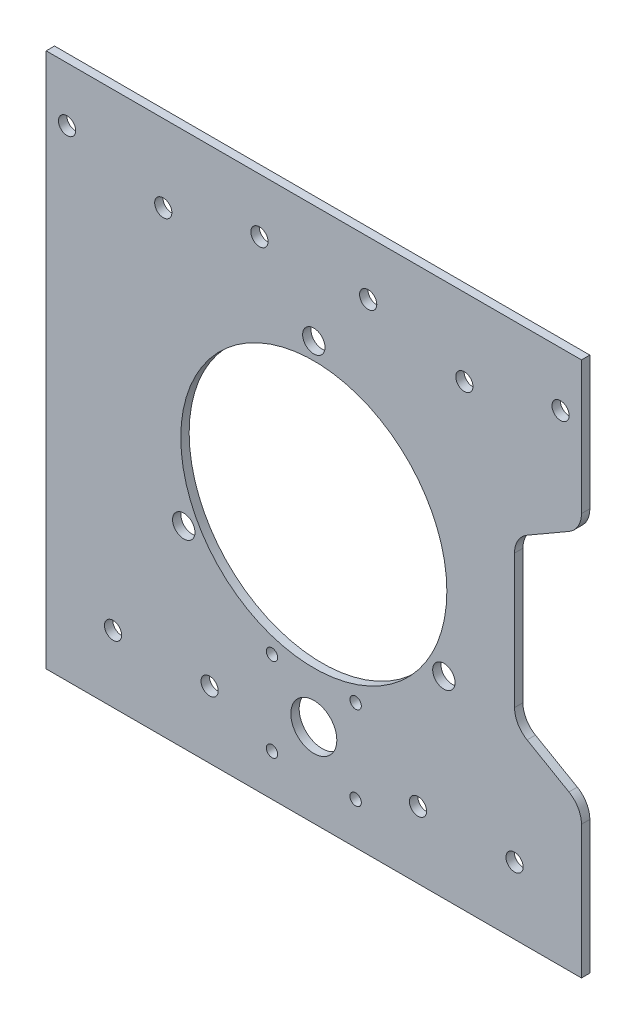
ISO-10303-21;
HEADER;
FILE_DESCRIPTION(('STEP AP214'),'2;1');
FILE_NAME('part.step','',(''),(''),'','','');
FILE_SCHEMA(('AUTOMOTIVE_DESIGN { 1 0 10303 214 1 1 1 1 }'));
ENDSEC;
DATA;
#1=APPLICATION_CONTEXT('core data for automotive mechanical design processes');
#2=APPLICATION_PROTOCOL_DEFINITION('international standard','automotive_design',2000,#1);
#3=PRODUCT_CONTEXT('',#1,'mechanical');
#4=PRODUCT('Part','Part','',(#3));
#5=PRODUCT_RELATED_PRODUCT_CATEGORY('part','',(#4));
#6=PRODUCT_DEFINITION_FORMATION('','',#4);
#7=PRODUCT_DEFINITION_CONTEXT('part definition',#1,'design');
#8=PRODUCT_DEFINITION('design','',#6,#7);
#9=PRODUCT_DEFINITION_SHAPE('','',#8);
#10=(LENGTH_UNIT() NAMED_UNIT(*) SI_UNIT(.MILLI.,.METRE.));
#11=(NAMED_UNIT(*) PLANE_ANGLE_UNIT() SI_UNIT($,.RADIAN.));
#12=(NAMED_UNIT(*) SI_UNIT($,.STERADIAN.) SOLID_ANGLE_UNIT());
#13=UNCERTAINTY_MEASURE_WITH_UNIT(LENGTH_MEASURE(1.E-05),#10,'distance_accuracy_value','');
#14=(GEOMETRIC_REPRESENTATION_CONTEXT(3) GLOBAL_UNCERTAINTY_ASSIGNED_CONTEXT((#13)) GLOBAL_UNIT_ASSIGNED_CONTEXT((#10,
#11,#12)) REPRESENTATION_CONTEXT('',''));
#15=CARTESIAN_POINT('',(0.,0.,0.));
#16=DIRECTION('',(0.,0.,1.));
#17=DIRECTION('',(1.,0.,0.));
#18=AXIS2_PLACEMENT_3D('',#15,#16,#17);
#19=CARTESIAN_POINT('',(101.6,-101.6,-3.175));
#20=DIRECTION('',(1.,0.,0.));
#21=DIRECTION('',(0.,0.,-1.));
#22=AXIS2_PLACEMENT_3D('',#19,#20,#21);
#23=PLANE('',#22);
#24=DIRECTION('',(0.,1.,0.));
#25=VECTOR('',#24,1.);
#26=CARTESIAN_POINT('',(101.6,-101.6,0.));
#27=LINE('',#26,#25);
#28=CARTESIAN_POINT('',(101.6,51.063219465479,0.));
#29=VERTEX_POINT('',#28);
#30=CARTESIAN_POINT('',(101.6,101.6,0.));
#31=VERTEX_POINT('',#30);
#32=EDGE_CURVE('E221',#29,#31,#27,.T.);
#33=ORIENTED_EDGE('',*,*,#32,.F.);
#34=DIRECTION('',(0.,0.,1.));
#35=VECTOR('',#34,1.);
#36=CARTESIAN_POINT('',(101.6,51.063219465479,-3.175));
#37=LINE('',#36,#35);
#38=CARTESIAN_POINT('',(101.6,51.063219465479,-3.175));
#39=VERTEX_POINT('',#38);
#40=EDGE_CURVE('E194',#39,#29,#37,.T.);
#41=ORIENTED_EDGE('',*,*,#40,.F.);
#42=DIRECTION('',(0.,1.,0.));
#43=VECTOR('',#42,1.);
#44=CARTESIAN_POINT('',(101.6,-101.6,-3.175));
#45=LINE('',#44,#43);
#46=CARTESIAN_POINT('',(101.6,101.6,-3.175));
#47=VERTEX_POINT('',#46);
#48=EDGE_CURVE('E83',#39,#47,#45,.T.);
#49=ORIENTED_EDGE('',*,*,#48,.T.);
#50=DIRECTION('',(0.,0.,1.));
#51=VECTOR('',#50,1.);
#52=CARTESIAN_POINT('',(101.6,101.6,-3.175));
#53=LINE('',#52,#51);
#54=EDGE_CURVE('E36',#47,#31,#53,.T.);
#55=ORIENTED_EDGE('',*,*,#54,.T.);
#56=EDGE_LOOP('',(#33,#41,#49,#55));
#57=FACE_BOUND('',#56,.T.);
#58=ADVANCED_FACE('F32',(#57),#23,.T.);
#59=DIRECTION('',(0.,0.,1.));
#60=VECTOR('',#59,1.);
#61=CARTESIAN_POINT('',(101.6,-51.0632194654789,-3.175));
#62=LINE('',#61,#60);
#63=CARTESIAN_POINT('',(101.6,-51.0632194654789,-3.175));
#64=VERTEX_POINT('',#63);
#65=CARTESIAN_POINT('',(101.6,-51.0632194654789,0.));
#66=VERTEX_POINT('',#65);
#67=EDGE_CURVE('E196',#64,#66,#62,.T.);
#68=ORIENTED_EDGE('',*,*,#67,.T.);
#69=CARTESIAN_POINT('',(101.6,-101.6,0.));
#70=VERTEX_POINT('',#69);
#71=EDGE_CURVE('E234',#70,#66,#27,.T.);
#72=ORIENTED_EDGE('',*,*,#71,.F.);
#73=DIRECTION('',(0.,0.,1.));
#74=VECTOR('',#73,1.);
#75=CARTESIAN_POINT('',(101.6,-101.6,-3.175));
#76=LINE('',#75,#74);
#77=CARTESIAN_POINT('',(101.6,-101.6,-3.175));
#78=VERTEX_POINT('',#77);
#79=EDGE_CURVE('E11',#78,#70,#76,.T.);
#80=ORIENTED_EDGE('',*,*,#79,.F.);
#81=EDGE_CURVE('E224',#78,#64,#45,.T.);
#82=ORIENTED_EDGE('',*,*,#81,.T.);
#83=EDGE_LOOP('',(#68,#72,#80,#82));
#84=FACE_BOUND('',#83,.T.);
#85=ADVANCED_FACE('F34',(#84),#23,.T.);
#86=CARTESIAN_POINT('',(-101.6,-101.6,-3.175));
#87=DIRECTION('',(0.,-1.,0.));
#88=DIRECTION('',(0.,0.,-1.));
#89=AXIS2_PLACEMENT_3D('',#86,#87,#88);
#90=PLANE('',#89);
#91=DIRECTION('',(1.,0.,0.));
#92=VECTOR('',#91,1.);
#93=CARTESIAN_POINT('',(-101.6,-101.6,0.));
#94=LINE('',#93,#92);
#95=CARTESIAN_POINT('',(-101.6,-101.6,0.));
#96=VERTEX_POINT('',#95);
#97=EDGE_CURVE('E243',#96,#70,#94,.T.);
#98=ORIENTED_EDGE('',*,*,#97,.F.);
#99=DIRECTION('',(0.,0.,1.));
#100=VECTOR('',#99,1.);
#101=CARTESIAN_POINT('',(-101.6,-101.6,-3.175));
#102=LINE('',#101,#100);
#103=CARTESIAN_POINT('',(-101.6,-101.6,-3.175));
#104=VERTEX_POINT('',#103);
#105=EDGE_CURVE('E41',#104,#96,#102,.T.);
#106=ORIENTED_EDGE('',*,*,#105,.F.);
#107=DIRECTION('',(1.,0.,0.));
#108=VECTOR('',#107,1.);
#109=CARTESIAN_POINT('',(-101.6,-101.6,-3.175));
#110=LINE('',#109,#108);
#111=EDGE_CURVE('E232',#104,#78,#110,.T.);
#112=ORIENTED_EDGE('',*,*,#111,.T.);
#113=ORIENTED_EDGE('',*,*,#79,.T.);
#114=EDGE_LOOP('',(#98,#106,#112,#113));
#115=FACE_BOUND('',#114,.T.);
#116=ADVANCED_FACE('F265',(#115),#90,.T.);
#117=CARTESIAN_POINT('',(-101.6,-101.6,-3.175));
#118=DIRECTION('',(-1.,0.,0.));
#119=DIRECTION('',(0.,0.,1.));
#120=AXIS2_PLACEMENT_3D('',#117,#118,#119);
#121=PLANE('',#120);
#122=DIRECTION('',(0.,-1.,0.));
#123=VECTOR('',#122,1.);
#124=CARTESIAN_POINT('',(-101.6,-101.6,0.));
#125=LINE('',#124,#123);
#126=CARTESIAN_POINT('',(-101.6,101.6,0.));
#127=VERTEX_POINT('',#126);
#128=EDGE_CURVE('E240',#127,#96,#125,.T.);
#129=ORIENTED_EDGE('',*,*,#128,.F.);
#130=DIRECTION('',(0.,0.,1.));
#131=VECTOR('',#130,1.);
#132=CARTESIAN_POINT('',(-101.6,101.6,-3.175));
#133=LINE('',#132,#131);
#134=CARTESIAN_POINT('',(-101.6,101.6,-3.175));
#135=VERTEX_POINT('',#134);
#136=EDGE_CURVE('E246',#135,#127,#133,.T.);
#137=ORIENTED_EDGE('',*,*,#136,.F.);
#138=DIRECTION('',(0.,-1.,0.));
#139=VECTOR('',#138,1.);
#140=CARTESIAN_POINT('',(-101.6,-101.6,-3.175));
#141=LINE('',#140,#139);
#142=EDGE_CURVE('E229',#135,#104,#141,.T.);
#143=ORIENTED_EDGE('',*,*,#142,.T.);
#144=ORIENTED_EDGE('',*,*,#105,.T.);
#145=EDGE_LOOP('',(#129,#137,#143,#144));
#146=FACE_BOUND('',#145,.T.);
#147=ADVANCED_FACE('F264',(#146),#121,.T.);
#148=CARTESIAN_POINT('',(-101.6,101.6,-3.175));
#149=DIRECTION('',(0.,1.,0.));
#150=DIRECTION('',(0.,0.,1.));
#151=AXIS2_PLACEMENT_3D('',#148,#149,#150);
#152=PLANE('',#151);
#153=DIRECTION('',(-1.,0.,0.));
#154=VECTOR('',#153,1.);
#155=CARTESIAN_POINT('',(-101.6,101.6,0.));
#156=LINE('',#155,#154);
#157=EDGE_CURVE('E237',#31,#127,#156,.T.);
#158=ORIENTED_EDGE('',*,*,#157,.F.);
#159=ORIENTED_EDGE('',*,*,#54,.F.);
#160=DIRECTION('',(-1.,0.,0.));
#161=VECTOR('',#160,1.);
#162=CARTESIAN_POINT('',(-101.6,101.6,-3.175));
#163=LINE('',#162,#161);
#164=EDGE_CURVE('E226',#47,#135,#163,.T.);
#165=ORIENTED_EDGE('',*,*,#164,.T.);
#166=ORIENTED_EDGE('',*,*,#136,.T.);
#167=EDGE_LOOP('',(#158,#159,#165,#166));
#168=FACE_BOUND('',#167,.T.);
#169=ADVANCED_FACE('F252',(#168),#152,.T.);
#170=CARTESIAN_POINT('',(0.,0.,-3.175));
#171=DIRECTION('',(0.,0.,-1.));
#172=DIRECTION('',(-1.,0.,0.));
#173=AXIS2_PLACEMENT_3D('',#170,#171,#172);
#174=PLANE('',#173);
#175=CARTESIAN_POINT('',(0.,-69.85,-3.175));
#176=DIRECTION('',(0.,0.,1.));
#177=DIRECTION('',(1.,0.,0.));
#178=AXIS2_PLACEMENT_3D('',#175,#176,#177);
#179=CIRCLE('',#178,8.73125);
#180=CARTESIAN_POINT('',(8.73125,-69.85,-3.175));
#181=VERTEX_POINT('',#180);
#182=EDGE_CURVE('E582',#181,#181,#179,.T.);
#183=ORIENTED_EDGE('',*,*,#182,.T.);
#184=EDGE_LOOP('',(#183));
#185=FACE_BOUND('',#184,.T.);
#186=CARTESIAN_POINT('',(-15.8749903367989,-53.9574937096368,-3.175));
#187=DIRECTION('',(0.,0.,1.));
#188=DIRECTION('',(1.,0.,0.));
#189=AXIS2_PLACEMENT_3D('',#186,#187,#188);
#190=CIRCLE('',#189,2.15265);
#191=CARTESIAN_POINT('',(-13.7223403367989,-53.9574937096368,-3.175));
#192=VERTEX_POINT('',#191);
#193=EDGE_CURVE('E592',#192,#192,#190,.T.);
#194=ORIENTED_EDGE('',*,*,#193,.T.);
#195=EDGE_LOOP('',(#194));
#196=FACE_BOUND('',#195,.T.);
#197=CARTESIAN_POINT('',(15.8749903367989,-53.9574937096368,-3.175));
#198=DIRECTION('',(0.,0.,1.));
#199=DIRECTION('',(1.,0.,0.));
#200=AXIS2_PLACEMENT_3D('',#197,#198,#199);
#201=CIRCLE('',#200,2.15265);
#202=CARTESIAN_POINT('',(18.0276403367989,-53.9574937096368,-3.175));
#203=VERTEX_POINT('',#202);
#204=EDGE_CURVE('E598',#203,#203,#201,.T.);
#205=ORIENTED_EDGE('',*,*,#204,.T.);
#206=EDGE_LOOP('',(#205));
#207=FACE_BOUND('',#206,.T.);
#208=CARTESIAN_POINT('',(-15.8749903367989,-85.7425062903632,-3.175));
#209=DIRECTION('',(0.,0.,1.));
#210=DIRECTION('',(1.,0.,0.));
#211=AXIS2_PLACEMENT_3D('',#208,#209,#210);
#212=CIRCLE('',#211,2.15265);
#213=CARTESIAN_POINT('',(-13.7223403367989,-85.7425062903632,-3.175));
#214=VERTEX_POINT('',#213);
#215=EDGE_CURVE('E604',#214,#214,#212,.T.);
#216=ORIENTED_EDGE('',*,*,#215,.T.);
#217=EDGE_LOOP('',(#216));
#218=FACE_BOUND('',#217,.T.);
#219=CARTESIAN_POINT('',(15.8749903367989,-85.7425062903632,-3.175));
#220=DIRECTION('',(0.,0.,1.));
#221=DIRECTION('',(1.,0.,0.));
#222=AXIS2_PLACEMENT_3D('',#219,#220,#221);
#223=CIRCLE('',#222,2.15265);
#224=CARTESIAN_POINT('',(18.0276403367989,-85.7425062903632,-3.175));
#225=VERTEX_POINT('',#224);
#226=EDGE_CURVE('E610',#225,#225,#223,.T.);
#227=ORIENTED_EDGE('',*,*,#226,.T.);
#228=EDGE_LOOP('',(#227));
#229=FACE_BOUND('',#228,.T.);
#230=CARTESIAN_POINT('',(-93.6625000000001,80.9625,-3.175));
#231=DIRECTION('',(0.,0.,1.));
#232=DIRECTION('',(1.,0.,0.));
#233=AXIS2_PLACEMENT_3D('',#230,#231,#232);
#234=CIRCLE('',#233,3.2639);
#235=CARTESIAN_POINT('',(-90.3986000000001,80.9625,-3.175));
#236=VERTEX_POINT('',#235);
#237=EDGE_CURVE('E616',#236,#236,#234,.T.);
#238=ORIENTED_EDGE('',*,*,#237,.T.);
#239=EDGE_LOOP('',(#238));
#240=FACE_BOUND('',#239,.T.);
#241=CARTESIAN_POINT('',(-57.15,72.23125,-3.175));
#242=DIRECTION('',(0.,0.,1.));
#243=DIRECTION('',(1.,0.,0.));
#244=AXIS2_PLACEMENT_3D('',#241,#242,#243);
#245=CIRCLE('',#244,3.2639);
#246=CARTESIAN_POINT('',(-53.8861,72.23125,-3.175));
#247=VERTEX_POINT('',#246);
#248=EDGE_CURVE('E622',#247,#247,#245,.T.);
#249=ORIENTED_EDGE('',*,*,#248,.T.);
#250=EDGE_LOOP('',(#249));
#251=FACE_BOUND('',#250,.T.);
#252=CARTESIAN_POINT('',(-20.6375,80.9625,-3.175));
#253=DIRECTION('',(0.,0.,1.));
#254=DIRECTION('',(1.,0.,0.));
#255=AXIS2_PLACEMENT_3D('',#252,#253,#254);
#256=CIRCLE('',#255,3.2639);
#257=CARTESIAN_POINT('',(-17.3736,80.9625,-3.175));
#258=VERTEX_POINT('',#257);
#259=EDGE_CURVE('E628',#258,#258,#256,.T.);
#260=ORIENTED_EDGE('',*,*,#259,.T.);
#261=EDGE_LOOP('',(#260));
#262=FACE_BOUND('',#261,.T.);
#263=CARTESIAN_POINT('',(20.6375,80.9625,-3.175));
#264=DIRECTION('',(0.,0.,1.));
#265=DIRECTION('',(1.,0.,0.));
#266=AXIS2_PLACEMENT_3D('',#263,#264,#265);
#267=CIRCLE('',#266,3.2639);
#268=CARTESIAN_POINT('',(23.9014,80.9625,-3.175));
#269=VERTEX_POINT('',#268);
#270=EDGE_CURVE('E634',#269,#269,#267,.T.);
#271=ORIENTED_EDGE('',*,*,#270,.T.);
#272=EDGE_LOOP('',(#271));
#273=FACE_BOUND('',#272,.T.);
#274=CARTESIAN_POINT('',(57.15,72.2312499999999,-3.175));
#275=DIRECTION('',(0.,0.,1.));
#276=DIRECTION('',(1.,0.,0.));
#277=AXIS2_PLACEMENT_3D('',#274,#275,#276);
#278=CIRCLE('',#277,3.2639);
#279=CARTESIAN_POINT('',(60.4139,72.2312499999999,-3.175));
#280=VERTEX_POINT('',#279);
#281=EDGE_CURVE('E640',#280,#280,#278,.T.);
#282=ORIENTED_EDGE('',*,*,#281,.T.);
#283=EDGE_LOOP('',(#282));
#284=FACE_BOUND('',#283,.T.);
#285=CARTESIAN_POINT('',(93.6625,80.9624999999999,-3.175));
#286=DIRECTION('',(0.,0.,1.));
#287=DIRECTION('',(1.,0.,0.));
#288=AXIS2_PLACEMENT_3D('',#285,#286,#287);
#289=CIRCLE('',#288,3.2639);
#290=CARTESIAN_POINT('',(96.9264,80.9624999999999,-3.175));
#291=VERTEX_POINT('',#290);
#292=EDGE_CURVE('E646',#291,#291,#289,.T.);
#293=ORIENTED_EDGE('',*,*,#292,.T.);
#294=EDGE_LOOP('',(#293));
#295=FACE_BOUND('',#294,.T.);
#296=CARTESIAN_POINT('',(76.2,-76.2,-3.175));
#297=DIRECTION('',(0.,0.,1.));
#298=DIRECTION('',(1.,0.,0.));
#299=AXIS2_PLACEMENT_3D('',#296,#297,#298);
#300=CIRCLE('',#299,3.2639);
#301=CARTESIAN_POINT('',(79.4639,-76.2,-3.175));
#302=VERTEX_POINT('',#301);
#303=EDGE_CURVE('E652',#302,#302,#300,.T.);
#304=ORIENTED_EDGE('',*,*,#303,.T.);
#305=EDGE_LOOP('',(#304));
#306=FACE_BOUND('',#305,.T.);
#307=CARTESIAN_POINT('',(39.5531119322837,-76.2,-3.175));
#308=DIRECTION('',(0.,0.,1.));
#309=DIRECTION('',(1.,0.,0.));
#310=AXIS2_PLACEMENT_3D('',#307,#308,#309);
#311=CIRCLE('',#310,3.2639);
#312=CARTESIAN_POINT('',(42.8170119322837,-76.2,-3.175));
#313=VERTEX_POINT('',#312);
#314=EDGE_CURVE('E658',#313,#313,#311,.T.);
#315=ORIENTED_EDGE('',*,*,#314,.T.);
#316=EDGE_LOOP('',(#315));
#317=FACE_BOUND('',#316,.T.);
#318=CARTESIAN_POINT('',(-39.5531119322837,-76.2,-3.175));
#319=DIRECTION('',(0.,0.,1.));
#320=DIRECTION('',(1.,0.,0.));
#321=AXIS2_PLACEMENT_3D('',#318,#319,#320);
#322=CIRCLE('',#321,3.2639);
#323=CARTESIAN_POINT('',(-36.2892119322837,-76.2,-3.175));
#324=VERTEX_POINT('',#323);
#325=EDGE_CURVE('E664',#324,#324,#322,.T.);
#326=ORIENTED_EDGE('',*,*,#325,.T.);
#327=EDGE_LOOP('',(#326));
#328=FACE_BOUND('',#327,.T.);
#329=CARTESIAN_POINT('',(-76.2,-76.2,-3.175));
#330=DIRECTION('',(0.,0.,1.));
#331=DIRECTION('',(1.,0.,0.));
#332=AXIS2_PLACEMENT_3D('',#329,#330,#331);
#333=CIRCLE('',#332,3.2639);
#334=CARTESIAN_POINT('',(-72.9361,-76.2,-3.175));
#335=VERTEX_POINT('',#334);
#336=EDGE_CURVE('E160',#335,#335,#333,.T.);
#337=ORIENTED_EDGE('',*,*,#336,.T.);
#338=EDGE_LOOP('',(#337));
#339=FACE_BOUND('',#338,.T.);
#340=CARTESIAN_POINT('',(92.075,51.063219465479,-3.175));
#341=DIRECTION('',(0.,0.,-1.));
#342=DIRECTION('',(-1.,0.,0.));
#343=AXIS2_PLACEMENT_3D('',#340,#341,#342);
#344=CIRCLE('',#343,9.52500000000001);
#345=CARTESIAN_POINT('',(96.8375,42.8143274944322,-3.175));
#346=VERTEX_POINT('',#345);
#347=EDGE_CURVE('E164',#39,#346,#344,.T.);
#348=ORIENTED_EDGE('',*,*,#347,.T.);
#349=DIRECTION('',(-0.866025403784436,-0.500000000000004,0.));
#350=VECTOR('',#349,1.);
#351=CARTESIAN_POINT('',(96.8375,42.8143274944322,-3.175));
#352=LINE('',#351,#350);
#353=CARTESIAN_POINT('',(80.9625,33.6488919710468,-3.175));
#354=VERTEX_POINT('',#353);
#355=EDGE_CURVE('E166',#346,#354,#352,.T.);
#356=ORIENTED_EDGE('',*,*,#355,.T.);
#357=CARTESIAN_POINT('',(85.725,25.4,-3.175));
#358=DIRECTION('',(0.,0.,1.));
#359=DIRECTION('',(1.,0.,0.));
#360=AXIS2_PLACEMENT_3D('',#357,#358,#359);
#361=CIRCLE('',#360,9.52500000000001);
#362=CARTESIAN_POINT('',(76.2,25.4,-3.175));
#363=VERTEX_POINT('',#362);
#364=EDGE_CURVE('E169',#354,#363,#361,.T.);
#365=ORIENTED_EDGE('',*,*,#364,.T.);
#366=DIRECTION('',(0.,-1.,0.));
#367=VECTOR('',#366,1.);
#368=CARTESIAN_POINT('',(76.2,25.4,-3.175));
#369=LINE('',#368,#367);
#370=CARTESIAN_POINT('',(76.2,-25.4,-3.175));
#371=VERTEX_POINT('',#370);
#372=EDGE_CURVE('E139',#363,#371,#369,.T.);
#373=ORIENTED_EDGE('',*,*,#372,.T.);
#374=CARTESIAN_POINT('',(85.725,-25.4,-3.175));
#375=DIRECTION('',(0.,0.,1.));
#376=DIRECTION('',(1.,0.,0.));
#377=AXIS2_PLACEMENT_3D('',#374,#375,#376);
#378=CIRCLE('',#377,9.52500000000001);
#379=CARTESIAN_POINT('',(80.9625,-33.6488919710468,-3.175));
#380=VERTEX_POINT('',#379);
#381=EDGE_CURVE('E133',#371,#380,#378,.T.);
#382=ORIENTED_EDGE('',*,*,#381,.T.);
#383=DIRECTION('',(0.866025403784437,-0.500000000000004,0.));
#384=VECTOR('',#383,1.);
#385=CARTESIAN_POINT('',(80.9625,-33.6488919710468,-3.175));
#386=LINE('',#385,#384);
#387=CARTESIAN_POINT('',(96.8375,-42.8143274944322,-3.175));
#388=VERTEX_POINT('',#387);
#389=EDGE_CURVE('E142',#380,#388,#386,.T.);
#390=ORIENTED_EDGE('',*,*,#389,.T.);
#391=CARTESIAN_POINT('',(92.075,-51.063219465479,-3.175));
#392=DIRECTION('',(0.,0.,-1.));
#393=DIRECTION('',(-1.,0.,0.));
#394=AXIS2_PLACEMENT_3D('',#391,#392,#393);
#395=CIRCLE('',#394,9.52500000000001);
#396=EDGE_CURVE('E147',#388,#64,#395,.T.);
#397=ORIENTED_EDGE('',*,*,#396,.T.);
#398=ORIENTED_EDGE('',*,*,#81,.F.);
#399=ORIENTED_EDGE('',*,*,#111,.F.);
#400=ORIENTED_EDGE('',*,*,#142,.F.);
#401=ORIENTED_EDGE('',*,*,#164,.F.);
#402=ORIENTED_EDGE('',*,*,#48,.F.);
#403=EDGE_LOOP('',(#348,#356,#365,#373,#382,#390,#397,#398,#399,#400,#401,#402));
#404=FACE_BOUND('',#403,.T.);
#405=CARTESIAN_POINT('',(49.3634480157131,-28.4999999999999,-3.175));
#406=DIRECTION('',(0.,0.,1.));
#407=DIRECTION('',(1.,0.,0.));
#408=AXIS2_PLACEMENT_3D('',#405,#406,#407);
#409=CIRCLE('',#408,4.25);
#410=CARTESIAN_POINT('',(53.6134480157131,-28.4999999999999,-3.175));
#411=VERTEX_POINT('',#410);
#412=EDGE_CURVE('E200',#411,#411,#409,.T.);
#413=ORIENTED_EDGE('',*,*,#412,.T.);
#414=EDGE_LOOP('',(#413));
#415=FACE_BOUND('',#414,.T.);
#416=CARTESIAN_POINT('',(-49.3634480157131,-28.4999999999999,-3.175));
#417=DIRECTION('',(0.,0.,1.));
#418=DIRECTION('',(1.,0.,0.));
#419=AXIS2_PLACEMENT_3D('',#416,#417,#418);
#420=CIRCLE('',#419,4.25);
#421=CARTESIAN_POINT('',(-45.1134480157131,-28.4999999999999,-3.175));
#422=VERTEX_POINT('',#421);
#423=EDGE_CURVE('E206',#422,#422,#420,.T.);
#424=ORIENTED_EDGE('',*,*,#423,.T.);
#425=EDGE_LOOP('',(#424));
#426=FACE_BOUND('',#425,.T.);
#427=CARTESIAN_POINT('',(0.,57.,-3.175));
#428=DIRECTION('',(0.,0.,1.));
#429=DIRECTION('',(1.,0.,0.));
#430=AXIS2_PLACEMENT_3D('',#427,#428,#429);
#431=CIRCLE('',#430,4.25);
#432=CARTESIAN_POINT('',(4.25,57.,-3.175));
#433=VERTEX_POINT('',#432);
#434=EDGE_CURVE('E212',#433,#433,#431,.T.);
#435=ORIENTED_EDGE('',*,*,#434,.T.);
#436=EDGE_LOOP('',(#435));
#437=FACE_BOUND('',#436,.T.);
#438=CARTESIAN_POINT('',(0.,0.,-3.175));
#439=DIRECTION('',(0.,0.,1.));
#440=DIRECTION('',(1.,0.,0.));
#441=AXIS2_PLACEMENT_3D('',#438,#439,#440);
#442=CIRCLE('',#441,50.5);
#443=CARTESIAN_POINT('',(50.5,0.,-3.175));
#444=VERTEX_POINT('',#443);
#445=EDGE_CURVE('E218',#444,#444,#442,.T.);
#446=ORIENTED_EDGE('',*,*,#445,.T.);
#447=EDGE_LOOP('',(#446));
#448=FACE_BOUND('',#447,.T.);
#449=ADVANCED_FACE('F150',(#185,#196,#207,#218,#229,#240,#251,#262,#273,#284,#295,#306,#317,
#328,#339,#404,#415,#426,#437,#448),#174,.T.);
#450=CARTESIAN_POINT('',(0.,0.,0.));
#451=DIRECTION('',(0.,0.,-1.));
#452=DIRECTION('',(-1.,0.,0.));
#453=AXIS2_PLACEMENT_3D('',#450,#451,#452);
#454=PLANE('',#453);
#455=CARTESIAN_POINT('',(0.,-69.85,0.));
#456=DIRECTION('',(0.,0.,1.));
#457=DIRECTION('',(1.,0.,0.));
#458=AXIS2_PLACEMENT_3D('',#455,#456,#457);
#459=CIRCLE('',#458,8.73125);
#460=CARTESIAN_POINT('',(8.73125,-69.85,0.));
#461=VERTEX_POINT('',#460);
#462=EDGE_CURVE('E585',#461,#461,#459,.T.);
#463=ORIENTED_EDGE('',*,*,#462,.F.);
#464=EDGE_LOOP('',(#463));
#465=FACE_BOUND('',#464,.T.);
#466=CARTESIAN_POINT('',(-15.8749903367989,-53.9574937096368,0.));
#467=DIRECTION('',(0.,0.,1.));
#468=DIRECTION('',(1.,0.,0.));
#469=AXIS2_PLACEMENT_3D('',#466,#467,#468);
#470=CIRCLE('',#469,2.15265);
#471=CARTESIAN_POINT('',(-13.7223403367989,-53.9574937096368,0.));
#472=VERTEX_POINT('',#471);
#473=EDGE_CURVE('E587',#472,#472,#470,.T.);
#474=ORIENTED_EDGE('',*,*,#473,.F.);
#475=EDGE_LOOP('',(#474));
#476=FACE_BOUND('',#475,.T.);
#477=CARTESIAN_POINT('',(15.8749903367989,-53.9574937096368,0.));
#478=DIRECTION('',(0.,0.,1.));
#479=DIRECTION('',(1.,0.,0.));
#480=AXIS2_PLACEMENT_3D('',#477,#478,#479);
#481=CIRCLE('',#480,2.15265);
#482=CARTESIAN_POINT('',(18.0276403367989,-53.9574937096368,0.));
#483=VERTEX_POINT('',#482);
#484=EDGE_CURVE('E595',#483,#483,#481,.T.);
#485=ORIENTED_EDGE('',*,*,#484,.F.);
#486=EDGE_LOOP('',(#485));
#487=FACE_BOUND('',#486,.T.);
#488=CARTESIAN_POINT('',(-15.8749903367989,-85.7425062903632,0.));
#489=DIRECTION('',(0.,0.,1.));
#490=DIRECTION('',(1.,0.,0.));
#491=AXIS2_PLACEMENT_3D('',#488,#489,#490);
#492=CIRCLE('',#491,2.15265);
#493=CARTESIAN_POINT('',(-13.7223403367989,-85.7425062903632,0.));
#494=VERTEX_POINT('',#493);
#495=EDGE_CURVE('E601',#494,#494,#492,.T.);
#496=ORIENTED_EDGE('',*,*,#495,.F.);
#497=EDGE_LOOP('',(#496));
#498=FACE_BOUND('',#497,.T.);
#499=CARTESIAN_POINT('',(15.8749903367989,-85.7425062903632,0.));
#500=DIRECTION('',(0.,0.,1.));
#501=DIRECTION('',(1.,0.,0.));
#502=AXIS2_PLACEMENT_3D('',#499,#500,#501);
#503=CIRCLE('',#502,2.15265);
#504=CARTESIAN_POINT('',(18.0276403367989,-85.7425062903632,0.));
#505=VERTEX_POINT('',#504);
#506=EDGE_CURVE('E607',#505,#505,#503,.T.);
#507=ORIENTED_EDGE('',*,*,#506,.F.);
#508=EDGE_LOOP('',(#507));
#509=FACE_BOUND('',#508,.T.);
#510=CARTESIAN_POINT('',(-93.6625000000001,80.9625,0.));
#511=DIRECTION('',(0.,0.,1.));
#512=DIRECTION('',(1.,0.,0.));
#513=AXIS2_PLACEMENT_3D('',#510,#511,#512);
#514=CIRCLE('',#513,3.2639);
#515=CARTESIAN_POINT('',(-90.3986000000001,80.9625,0.));
#516=VERTEX_POINT('',#515);
#517=EDGE_CURVE('E613',#516,#516,#514,.T.);
#518=ORIENTED_EDGE('',*,*,#517,.F.);
#519=EDGE_LOOP('',(#518));
#520=FACE_BOUND('',#519,.T.);
#521=CARTESIAN_POINT('',(-57.15,72.23125,0.));
#522=DIRECTION('',(0.,0.,1.));
#523=DIRECTION('',(1.,0.,0.));
#524=AXIS2_PLACEMENT_3D('',#521,#522,#523);
#525=CIRCLE('',#524,3.2639);
#526=CARTESIAN_POINT('',(-53.8861,72.23125,0.));
#527=VERTEX_POINT('',#526);
#528=EDGE_CURVE('E619',#527,#527,#525,.T.);
#529=ORIENTED_EDGE('',*,*,#528,.F.);
#530=EDGE_LOOP('',(#529));
#531=FACE_BOUND('',#530,.T.);
#532=CARTESIAN_POINT('',(-20.6375,80.9625,0.));
#533=DIRECTION('',(0.,0.,1.));
#534=DIRECTION('',(1.,0.,0.));
#535=AXIS2_PLACEMENT_3D('',#532,#533,#534);
#536=CIRCLE('',#535,3.2639);
#537=CARTESIAN_POINT('',(-17.3736,80.9625,0.));
#538=VERTEX_POINT('',#537);
#539=EDGE_CURVE('E625',#538,#538,#536,.T.);
#540=ORIENTED_EDGE('',*,*,#539,.F.);
#541=EDGE_LOOP('',(#540));
#542=FACE_BOUND('',#541,.T.);
#543=CARTESIAN_POINT('',(20.6375,80.9625,0.));
#544=DIRECTION('',(0.,0.,1.));
#545=DIRECTION('',(1.,0.,0.));
#546=AXIS2_PLACEMENT_3D('',#543,#544,#545);
#547=CIRCLE('',#546,3.2639);
#548=CARTESIAN_POINT('',(23.9014,80.9625,0.));
#549=VERTEX_POINT('',#548);
#550=EDGE_CURVE('E631',#549,#549,#547,.T.);
#551=ORIENTED_EDGE('',*,*,#550,.F.);
#552=EDGE_LOOP('',(#551));
#553=FACE_BOUND('',#552,.T.);
#554=CARTESIAN_POINT('',(57.15,72.2312499999999,0.));
#555=DIRECTION('',(0.,0.,1.));
#556=DIRECTION('',(1.,0.,0.));
#557=AXIS2_PLACEMENT_3D('',#554,#555,#556);
#558=CIRCLE('',#557,3.2639);
#559=CARTESIAN_POINT('',(60.4139,72.2312499999999,0.));
#560=VERTEX_POINT('',#559);
#561=EDGE_CURVE('E637',#560,#560,#558,.T.);
#562=ORIENTED_EDGE('',*,*,#561,.F.);
#563=EDGE_LOOP('',(#562));
#564=FACE_BOUND('',#563,.T.);
#565=CARTESIAN_POINT('',(93.6625,80.9624999999999,0.));
#566=DIRECTION('',(0.,0.,1.));
#567=DIRECTION('',(1.,0.,0.));
#568=AXIS2_PLACEMENT_3D('',#565,#566,#567);
#569=CIRCLE('',#568,3.2639);
#570=CARTESIAN_POINT('',(96.9264,80.9624999999999,0.));
#571=VERTEX_POINT('',#570);
#572=EDGE_CURVE('E643',#571,#571,#569,.T.);
#573=ORIENTED_EDGE('',*,*,#572,.F.);
#574=EDGE_LOOP('',(#573));
#575=FACE_BOUND('',#574,.T.);
#576=CARTESIAN_POINT('',(76.2,-76.2,0.));
#577=DIRECTION('',(0.,0.,1.));
#578=DIRECTION('',(1.,0.,0.));
#579=AXIS2_PLACEMENT_3D('',#576,#577,#578);
#580=CIRCLE('',#579,3.2639);
#581=CARTESIAN_POINT('',(79.4639,-76.2,0.));
#582=VERTEX_POINT('',#581);
#583=EDGE_CURVE('E649',#582,#582,#580,.T.);
#584=ORIENTED_EDGE('',*,*,#583,.F.);
#585=EDGE_LOOP('',(#584));
#586=FACE_BOUND('',#585,.T.);
#587=CARTESIAN_POINT('',(39.5531119322837,-76.2,0.));
#588=DIRECTION('',(0.,0.,1.));
#589=DIRECTION('',(1.,0.,0.));
#590=AXIS2_PLACEMENT_3D('',#587,#588,#589);
#591=CIRCLE('',#590,3.2639);
#592=CARTESIAN_POINT('',(42.8170119322837,-76.2,0.));
#593=VERTEX_POINT('',#592);
#594=EDGE_CURVE('E655',#593,#593,#591,.T.);
#595=ORIENTED_EDGE('',*,*,#594,.F.);
#596=EDGE_LOOP('',(#595));
#597=FACE_BOUND('',#596,.T.);
#598=CARTESIAN_POINT('',(-39.5531119322837,-76.2,0.));
#599=DIRECTION('',(0.,0.,1.));
#600=DIRECTION('',(1.,0.,0.));
#601=AXIS2_PLACEMENT_3D('',#598,#599,#600);
#602=CIRCLE('',#601,3.2639);
#603=CARTESIAN_POINT('',(-36.2892119322837,-76.2,0.));
#604=VERTEX_POINT('',#603);
#605=EDGE_CURVE('E661',#604,#604,#602,.T.);
#606=ORIENTED_EDGE('',*,*,#605,.F.);
#607=EDGE_LOOP('',(#606));
#608=FACE_BOUND('',#607,.T.);
#609=CARTESIAN_POINT('',(-76.2,-76.2,0.));
#610=DIRECTION('',(0.,0.,1.));
#611=DIRECTION('',(1.,0.,0.));
#612=AXIS2_PLACEMENT_3D('',#609,#610,#611);
#613=CIRCLE('',#612,3.2639);
#614=CARTESIAN_POINT('',(-72.9361,-76.2,0.));
#615=VERTEX_POINT('',#614);
#616=EDGE_CURVE('E666',#615,#615,#613,.T.);
#617=ORIENTED_EDGE('',*,*,#616,.F.);
#618=EDGE_LOOP('',(#617));
#619=FACE_BOUND('',#618,.T.);
#620=CARTESIAN_POINT('',(49.3634480157131,-28.4999999999999,0.));
#621=DIRECTION('',(0.,0.,1.));
#622=DIRECTION('',(1.,0.,0.));
#623=AXIS2_PLACEMENT_3D('',#620,#621,#622);
#624=CIRCLE('',#623,4.25);
#625=CARTESIAN_POINT('',(53.6134480157131,-28.4999999999999,0.));
#626=VERTEX_POINT('',#625);
#627=EDGE_CURVE('E187',#626,#626,#624,.T.);
#628=ORIENTED_EDGE('',*,*,#627,.F.);
#629=EDGE_LOOP('',(#628));
#630=FACE_BOUND('',#629,.T.);
#631=CARTESIAN_POINT('',(-49.3634480157131,-28.4999999999999,0.));
#632=DIRECTION('',(0.,0.,1.));
#633=DIRECTION('',(1.,0.,0.));
#634=AXIS2_PLACEMENT_3D('',#631,#632,#633);
#635=CIRCLE('',#634,4.25);
#636=CARTESIAN_POINT('',(-45.1134480157131,-28.4999999999999,0.));
#637=VERTEX_POINT('',#636);
#638=EDGE_CURVE('E203',#637,#637,#635,.T.);
#639=ORIENTED_EDGE('',*,*,#638,.F.);
#640=EDGE_LOOP('',(#639));
#641=FACE_BOUND('',#640,.T.);
#642=CARTESIAN_POINT('',(0.,57.,0.));
#643=DIRECTION('',(0.,0.,1.));
#644=DIRECTION('',(1.,0.,0.));
#645=AXIS2_PLACEMENT_3D('',#642,#643,#644);
#646=CIRCLE('',#645,4.25);
#647=CARTESIAN_POINT('',(4.25,57.,0.));
#648=VERTEX_POINT('',#647);
#649=EDGE_CURVE('E209',#648,#648,#646,.T.);
#650=ORIENTED_EDGE('',*,*,#649,.F.);
#651=EDGE_LOOP('',(#650));
#652=FACE_BOUND('',#651,.T.);
#653=CARTESIAN_POINT('',(0.,0.,0.));
#654=DIRECTION('',(0.,0.,1.));
#655=DIRECTION('',(1.,0.,0.));
#656=AXIS2_PLACEMENT_3D('',#653,#654,#655);
#657=CIRCLE('',#656,50.5);
#658=CARTESIAN_POINT('',(50.5,0.,0.));
#659=VERTEX_POINT('',#658);
#660=EDGE_CURVE('E215',#659,#659,#657,.T.);
#661=ORIENTED_EDGE('',*,*,#660,.F.);
#662=EDGE_LOOP('',(#661));
#663=FACE_BOUND('',#662,.T.);
#664=DIRECTION('',(-0.866025403784436,-0.500000000000004,0.));
#665=VECTOR('',#664,1.);
#666=CARTESIAN_POINT('',(96.8375,42.8143274944322,0.));
#667=LINE('',#666,#665);
#668=CARTESIAN_POINT('',(96.8375,42.8143274944322,0.));
#669=VERTEX_POINT('',#668);
#670=CARTESIAN_POINT('',(80.9625,33.6488919710468,0.));
#671=VERTEX_POINT('',#670);
#672=EDGE_CURVE('E180',#669,#671,#667,.T.);
#673=ORIENTED_EDGE('',*,*,#672,.F.);
#674=CARTESIAN_POINT('',(92.075,51.063219465479,0.));
#675=DIRECTION('',(0.,0.,-1.));
#676=DIRECTION('',(-1.,0.,0.));
#677=AXIS2_PLACEMENT_3D('',#674,#675,#676);
#678=CIRCLE('',#677,9.52500000000001);
#679=EDGE_CURVE('E177',#29,#669,#678,.T.);
#680=ORIENTED_EDGE('',*,*,#679,.F.);
#681=ORIENTED_EDGE('',*,*,#32,.T.);
#682=ORIENTED_EDGE('',*,*,#157,.T.);
#683=ORIENTED_EDGE('',*,*,#128,.T.);
#684=ORIENTED_EDGE('',*,*,#97,.T.);
#685=ORIENTED_EDGE('',*,*,#71,.T.);
#686=CARTESIAN_POINT('',(92.075,-51.063219465479,0.));
#687=DIRECTION('',(0.,0.,-1.));
#688=DIRECTION('',(-1.,0.,0.));
#689=AXIS2_PLACEMENT_3D('',#686,#687,#688);
#690=CIRCLE('',#689,9.52500000000001);
#691=CARTESIAN_POINT('',(96.8375,-42.8143274944322,0.));
#692=VERTEX_POINT('',#691);
#693=EDGE_CURVE('E175',#692,#66,#690,.T.);
#694=ORIENTED_EDGE('',*,*,#693,.F.);
#695=DIRECTION('',(0.866025403784437,-0.500000000000004,0.));
#696=VECTOR('',#695,1.);
#697=CARTESIAN_POINT('',(80.9625,-33.6488919710468,0.));
#698=LINE('',#697,#696);
#699=CARTESIAN_POINT('',(80.9625,-33.6488919710468,0.));
#700=VERTEX_POINT('',#699);
#701=EDGE_CURVE('E173',#700,#692,#698,.T.);
#702=ORIENTED_EDGE('',*,*,#701,.F.);
#703=CARTESIAN_POINT('',(85.725,-25.4,0.));
#704=DIRECTION('',(0.,0.,1.));
#705=DIRECTION('',(1.,0.,0.));
#706=AXIS2_PLACEMENT_3D('',#703,#704,#705);
#707=CIRCLE('',#706,9.52500000000001);
#708=CARTESIAN_POINT('',(76.2,-25.4,0.));
#709=VERTEX_POINT('',#708);
#710=EDGE_CURVE('E49',#709,#700,#707,.T.);
#711=ORIENTED_EDGE('',*,*,#710,.F.);
#712=DIRECTION('',(0.,-1.,0.));
#713=VECTOR('',#712,1.);
#714=CARTESIAN_POINT('',(76.2,25.4,0.));
#715=LINE('',#714,#713);
#716=CARTESIAN_POINT('',(76.2,25.4,0.));
#717=VERTEX_POINT('',#716);
#718=EDGE_CURVE('E154',#717,#709,#715,.T.);
#719=ORIENTED_EDGE('',*,*,#718,.F.);
#720=CARTESIAN_POINT('',(85.725,25.4,0.));
#721=DIRECTION('',(0.,0.,1.));
#722=DIRECTION('',(1.,0.,0.));
#723=AXIS2_PLACEMENT_3D('',#720,#721,#722);
#724=CIRCLE('',#723,9.52500000000001);
#725=EDGE_CURVE('E157',#671,#717,#724,.T.);
#726=ORIENTED_EDGE('',*,*,#725,.F.);
#727=EDGE_LOOP('',(#673,#680,#681,#682,#683,#684,#685,#694,#702,#711,#719,#726));
#728=FACE_BOUND('',#727,.T.);
#729=ADVANCED_FACE('F255',(#465,#476,#487,#498,#509,#520,#531,#542,#553,#564,#575,#586,#597,
#608,#619,#630,#641,#652,#663,#728),#454,.F.);
#730=CARTESIAN_POINT('',(0.,0.,-3.175));
#731=DIRECTION('',(0.,0.,1.));
#732=DIRECTION('',(1.,0.,0.));
#733=AXIS2_PLACEMENT_3D('',#730,#731,#732);
#734=CYLINDRICAL_SURFACE('',#733,50.5);
#735=ORIENTED_EDGE('',*,*,#445,.F.);
#736=EDGE_LOOP('',(#735));
#737=FACE_BOUND('',#736,.T.);
#738=ORIENTED_EDGE('',*,*,#660,.T.);
#739=EDGE_LOOP('',(#738));
#740=FACE_BOUND('',#739,.T.);
#741=ADVANCED_FACE('F307',(#737,#740),#734,.F.);
#742=CARTESIAN_POINT('',(0.,57.,-3.175));
#743=DIRECTION('',(0.,0.,1.));
#744=DIRECTION('',(1.,0.,0.));
#745=AXIS2_PLACEMENT_3D('',#742,#743,#744);
#746=CYLINDRICAL_SURFACE('',#745,4.25);
#747=ORIENTED_EDGE('',*,*,#434,.F.);
#748=EDGE_LOOP('',(#747));
#749=FACE_BOUND('',#748,.T.);
#750=ORIENTED_EDGE('',*,*,#649,.T.);
#751=EDGE_LOOP('',(#750));
#752=FACE_BOUND('',#751,.T.);
#753=ADVANCED_FACE('F314',(#749,#752),#746,.F.);
#754=CARTESIAN_POINT('',(-49.3634480157131,-28.4999999999999,-3.175));
#755=DIRECTION('',(0.,0.,1.));
#756=DIRECTION('',(1.,0.,0.));
#757=AXIS2_PLACEMENT_3D('',#754,#755,#756);
#758=CYLINDRICAL_SURFACE('',#757,4.25);
#759=ORIENTED_EDGE('',*,*,#423,.F.);
#760=EDGE_LOOP('',(#759));
#761=FACE_BOUND('',#760,.T.);
#762=ORIENTED_EDGE('',*,*,#638,.T.);
#763=EDGE_LOOP('',(#762));
#764=FACE_BOUND('',#763,.T.);
#765=ADVANCED_FACE('F318',(#761,#764),#758,.F.);
#766=CARTESIAN_POINT('',(49.3634480157131,-28.4999999999999,-3.175));
#767=DIRECTION('',(0.,0.,1.));
#768=DIRECTION('',(1.,0.,0.));
#769=AXIS2_PLACEMENT_3D('',#766,#767,#768);
#770=CYLINDRICAL_SURFACE('',#769,4.25);
#771=ORIENTED_EDGE('',*,*,#412,.F.);
#772=EDGE_LOOP('',(#771));
#773=FACE_BOUND('',#772,.T.);
#774=ORIENTED_EDGE('',*,*,#627,.T.);
#775=EDGE_LOOP('',(#774));
#776=FACE_BOUND('',#775,.T.);
#777=ADVANCED_FACE('F322',(#773,#776),#770,.F.);
#778=CARTESIAN_POINT('',(85.725,-25.4,-3.175));
#779=DIRECTION('',(0.,0.,1.));
#780=DIRECTION('',(1.,0.,0.));
#781=AXIS2_PLACEMENT_3D('',#778,#779,#780);
#782=CYLINDRICAL_SURFACE('',#781,9.52500000000001);
#783=ORIENTED_EDGE('',*,*,#710,.T.);
#784=DIRECTION('',(0.,0.,1.));
#785=VECTOR('',#784,1.);
#786=CARTESIAN_POINT('',(80.9625,-33.6488919710468,-3.175));
#787=LINE('',#786,#785);
#788=EDGE_CURVE('E129',#380,#700,#787,.T.);
#789=ORIENTED_EDGE('',*,*,#788,.F.);
#790=ORIENTED_EDGE('',*,*,#381,.F.);
#791=DIRECTION('',(0.,0.,1.));
#792=VECTOR('',#791,1.);
#793=CARTESIAN_POINT('',(76.2,-25.4,-3.175));
#794=LINE('',#793,#792);
#795=EDGE_CURVE('E185',#371,#709,#794,.T.);
#796=ORIENTED_EDGE('',*,*,#795,.T.);
#797=EDGE_LOOP('',(#783,#789,#790,#796));
#798=FACE_BOUND('',#797,.T.);
#799=ADVANCED_FACE('F131',(#798),#782,.F.);
#800=CARTESIAN_POINT('',(76.2,25.4,-3.175));
#801=DIRECTION('',(-1.,0.,0.));
#802=DIRECTION('',(0.,0.,1.));
#803=AXIS2_PLACEMENT_3D('',#800,#801,#802);
#804=PLANE('',#803);
#805=ORIENTED_EDGE('',*,*,#718,.T.);
#806=ORIENTED_EDGE('',*,*,#795,.F.);
#807=ORIENTED_EDGE('',*,*,#372,.F.);
#808=DIRECTION('',(0.,0.,1.));
#809=VECTOR('',#808,1.);
#810=CARTESIAN_POINT('',(76.2,25.4,-3.175));
#811=LINE('',#810,#809);
#812=EDGE_CURVE('E188',#363,#717,#811,.T.);
#813=ORIENTED_EDGE('',*,*,#812,.T.);
#814=EDGE_LOOP('',(#805,#806,#807,#813));
#815=FACE_BOUND('',#814,.T.);
#816=ADVANCED_FACE('F271',(#815),#804,.F.);
#817=CARTESIAN_POINT('',(85.725,25.4,-3.175));
#818=DIRECTION('',(0.,0.,1.));
#819=DIRECTION('',(1.,0.,0.));
#820=AXIS2_PLACEMENT_3D('',#817,#818,#819);
#821=CYLINDRICAL_SURFACE('',#820,9.52500000000001);
#822=ORIENTED_EDGE('',*,*,#725,.T.);
#823=ORIENTED_EDGE('',*,*,#812,.F.);
#824=ORIENTED_EDGE('',*,*,#364,.F.);
#825=DIRECTION('',(0.,0.,1.));
#826=VECTOR('',#825,1.);
#827=CARTESIAN_POINT('',(80.9625,33.6488919710468,-3.175));
#828=LINE('',#827,#826);
#829=EDGE_CURVE('E190',#354,#671,#828,.T.);
#830=ORIENTED_EDGE('',*,*,#829,.T.);
#831=EDGE_LOOP('',(#822,#823,#824,#830));
#832=FACE_BOUND('',#831,.T.);
#833=ADVANCED_FACE('F274',(#832),#821,.F.);
#834=CARTESIAN_POINT('',(96.8375,42.8143274944322,-3.175));
#835=DIRECTION('',(-0.500000000000004,0.866025403784436,0.));
#836=DIRECTION('',(-0.866025403784436,-0.500000000000004,0.));
#837=AXIS2_PLACEMENT_3D('',#834,#835,#836);
#838=PLANE('',#837);
#839=ORIENTED_EDGE('',*,*,#672,.T.);
#840=ORIENTED_EDGE('',*,*,#829,.F.);
#841=ORIENTED_EDGE('',*,*,#355,.F.);
#842=DIRECTION('',(0.,0.,1.));
#843=VECTOR('',#842,1.);
#844=CARTESIAN_POINT('',(96.8375,42.8143274944322,-3.175));
#845=LINE('',#844,#843);
#846=EDGE_CURVE('E192',#346,#669,#845,.T.);
#847=ORIENTED_EDGE('',*,*,#846,.T.);
#848=EDGE_LOOP('',(#839,#840,#841,#847));
#849=FACE_BOUND('',#848,.T.);
#850=ADVANCED_FACE('F276',(#849),#838,.F.);
#851=CARTESIAN_POINT('',(92.075,51.063219465479,-3.175));
#852=DIRECTION('',(0.,0.,1.));
#853=DIRECTION('',(1.,0.,0.));
#854=AXIS2_PLACEMENT_3D('',#851,#852,#853);
#855=CYLINDRICAL_SURFACE('',#854,9.52500000000001);
#856=ORIENTED_EDGE('',*,*,#679,.T.);
#857=ORIENTED_EDGE('',*,*,#846,.F.);
#858=ORIENTED_EDGE('',*,*,#347,.F.);
#859=ORIENTED_EDGE('',*,*,#40,.T.);
#860=EDGE_LOOP('',(#856,#857,#858,#859));
#861=FACE_BOUND('',#860,.T.);
#862=ADVANCED_FACE('F259',(#861),#855,.T.);
#863=CARTESIAN_POINT('',(92.075,-51.063219465479,-3.175));
#864=DIRECTION('',(0.,0.,1.));
#865=DIRECTION('',(1.,0.,0.));
#866=AXIS2_PLACEMENT_3D('',#863,#864,#865);
#867=CYLINDRICAL_SURFACE('',#866,9.52500000000001);
#868=ORIENTED_EDGE('',*,*,#693,.T.);
#869=ORIENTED_EDGE('',*,*,#67,.F.);
#870=ORIENTED_EDGE('',*,*,#396,.F.);
#871=DIRECTION('',(0.,0.,1.));
#872=VECTOR('',#871,1.);
#873=CARTESIAN_POINT('',(96.8375,-42.8143274944322,-3.175));
#874=LINE('',#873,#872);
#875=EDGE_CURVE('E138',#388,#692,#874,.T.);
#876=ORIENTED_EDGE('',*,*,#875,.T.);
#877=EDGE_LOOP('',(#868,#869,#870,#876));
#878=FACE_BOUND('',#877,.T.);
#879=ADVANCED_FACE('F268',(#878),#867,.T.);
#880=CARTESIAN_POINT('',(80.9625,-33.6488919710468,-3.175));
#881=DIRECTION('',(-0.500000000000004,-0.866025403784436,0.));
#882=DIRECTION('',(0.866025403784437,-0.500000000000004,0.));
#883=AXIS2_PLACEMENT_3D('',#880,#881,#882);
#884=PLANE('',#883);
#885=ORIENTED_EDGE('',*,*,#701,.T.);
#886=ORIENTED_EDGE('',*,*,#875,.F.);
#887=ORIENTED_EDGE('',*,*,#389,.F.);
#888=ORIENTED_EDGE('',*,*,#788,.T.);
#889=EDGE_LOOP('',(#885,#886,#887,#888));
#890=FACE_BOUND('',#889,.T.);
#891=ADVANCED_FACE('F143',(#890),#884,.F.);
#892=CARTESIAN_POINT('',(-76.2,-76.2,0.));
#893=DIRECTION('',(0.,0.,1.));
#894=DIRECTION('',(1.,0.,0.));
#895=AXIS2_PLACEMENT_3D('',#892,#893,#894);
#896=CYLINDRICAL_SURFACE('',#895,3.2639);
#897=ORIENTED_EDGE('',*,*,#336,.F.);
#898=EDGE_LOOP('',(#897));
#899=FACE_BOUND('',#898,.T.);
#900=ORIENTED_EDGE('',*,*,#616,.T.);
#901=EDGE_LOOP('',(#900));
#902=FACE_BOUND('',#901,.T.);
#903=ADVANCED_FACE('F331',(#899,#902),#896,.F.);
#904=CARTESIAN_POINT('',(-39.5531119322837,-76.2,0.));
#905=DIRECTION('',(0.,0.,1.));
#906=DIRECTION('',(1.,0.,0.));
#907=AXIS2_PLACEMENT_3D('',#904,#905,#906);
#908=CYLINDRICAL_SURFACE('',#907,3.2639);
#909=ORIENTED_EDGE('',*,*,#325,.F.);
#910=EDGE_LOOP('',(#909));
#911=FACE_BOUND('',#910,.T.);
#912=ORIENTED_EDGE('',*,*,#605,.T.);
#913=EDGE_LOOP('',(#912));
#914=FACE_BOUND('',#913,.T.);
#915=ADVANCED_FACE('F347',(#911,#914),#908,.F.);
#916=CARTESIAN_POINT('',(39.5531119322837,-76.2,0.));
#917=DIRECTION('',(0.,0.,1.));
#918=DIRECTION('',(1.,0.,0.));
#919=AXIS2_PLACEMENT_3D('',#916,#917,#918);
#920=CYLINDRICAL_SURFACE('',#919,3.2639);
#921=ORIENTED_EDGE('',*,*,#314,.F.);
#922=EDGE_LOOP('',(#921));
#923=FACE_BOUND('',#922,.T.);
#924=ORIENTED_EDGE('',*,*,#594,.T.);
#925=EDGE_LOOP('',(#924));
#926=FACE_BOUND('',#925,.T.);
#927=ADVANCED_FACE('F355',(#923,#926),#920,.F.);
#928=CARTESIAN_POINT('',(76.2,-76.2,0.));
#929=DIRECTION('',(0.,0.,1.));
#930=DIRECTION('',(1.,0.,0.));
#931=AXIS2_PLACEMENT_3D('',#928,#929,#930);
#932=CYLINDRICAL_SURFACE('',#931,3.2639);
#933=ORIENTED_EDGE('',*,*,#303,.F.);
#934=EDGE_LOOP('',(#933));
#935=FACE_BOUND('',#934,.T.);
#936=ORIENTED_EDGE('',*,*,#583,.T.);
#937=EDGE_LOOP('',(#936));
#938=FACE_BOUND('',#937,.T.);
#939=ADVANCED_FACE('F363',(#935,#938),#932,.F.);
#940=CARTESIAN_POINT('',(93.6625,80.9624999999999,0.));
#941=DIRECTION('',(0.,0.,1.));
#942=DIRECTION('',(1.,0.,0.));
#943=AXIS2_PLACEMENT_3D('',#940,#941,#942);
#944=CYLINDRICAL_SURFACE('',#943,3.2639);
#945=ORIENTED_EDGE('',*,*,#292,.F.);
#946=EDGE_LOOP('',(#945));
#947=FACE_BOUND('',#946,.T.);
#948=ORIENTED_EDGE('',*,*,#572,.T.);
#949=EDGE_LOOP('',(#948));
#950=FACE_BOUND('',#949,.T.);
#951=ADVANCED_FACE('F371',(#947,#950),#944,.F.);
#952=CARTESIAN_POINT('',(57.15,72.2312499999999,0.));
#953=DIRECTION('',(0.,0.,1.));
#954=DIRECTION('',(1.,0.,0.));
#955=AXIS2_PLACEMENT_3D('',#952,#953,#954);
#956=CYLINDRICAL_SURFACE('',#955,3.2639);
#957=ORIENTED_EDGE('',*,*,#281,.F.);
#958=EDGE_LOOP('',(#957));
#959=FACE_BOUND('',#958,.T.);
#960=ORIENTED_EDGE('',*,*,#561,.T.);
#961=EDGE_LOOP('',(#960));
#962=FACE_BOUND('',#961,.T.);
#963=ADVANCED_FACE('F379',(#959,#962),#956,.F.);
#964=CARTESIAN_POINT('',(20.6375,80.9625,0.));
#965=DIRECTION('',(0.,0.,1.));
#966=DIRECTION('',(1.,0.,0.));
#967=AXIS2_PLACEMENT_3D('',#964,#965,#966);
#968=CYLINDRICAL_SURFACE('',#967,3.2639);
#969=ORIENTED_EDGE('',*,*,#270,.F.);
#970=EDGE_LOOP('',(#969));
#971=FACE_BOUND('',#970,.T.);
#972=ORIENTED_EDGE('',*,*,#550,.T.);
#973=EDGE_LOOP('',(#972));
#974=FACE_BOUND('',#973,.T.);
#975=ADVANCED_FACE('F387',(#971,#974),#968,.F.);
#976=CARTESIAN_POINT('',(-20.6375,80.9625,0.));
#977=DIRECTION('',(0.,0.,1.));
#978=DIRECTION('',(1.,0.,0.));
#979=AXIS2_PLACEMENT_3D('',#976,#977,#978);
#980=CYLINDRICAL_SURFACE('',#979,3.2639);
#981=ORIENTED_EDGE('',*,*,#259,.F.);
#982=EDGE_LOOP('',(#981));
#983=FACE_BOUND('',#982,.T.);
#984=ORIENTED_EDGE('',*,*,#539,.T.);
#985=EDGE_LOOP('',(#984));
#986=FACE_BOUND('',#985,.T.);
#987=ADVANCED_FACE('F395',(#983,#986),#980,.F.);
#988=CARTESIAN_POINT('',(-57.15,72.23125,0.));
#989=DIRECTION('',(0.,0.,1.));
#990=DIRECTION('',(1.,0.,0.));
#991=AXIS2_PLACEMENT_3D('',#988,#989,#990);
#992=CYLINDRICAL_SURFACE('',#991,3.2639);
#993=ORIENTED_EDGE('',*,*,#248,.F.);
#994=EDGE_LOOP('',(#993));
#995=FACE_BOUND('',#994,.T.);
#996=ORIENTED_EDGE('',*,*,#528,.T.);
#997=EDGE_LOOP('',(#996));
#998=FACE_BOUND('',#997,.T.);
#999=ADVANCED_FACE('F403',(#995,#998),#992,.F.);
#1000=CARTESIAN_POINT('',(-93.6625000000001,80.9625,0.));
#1001=DIRECTION('',(0.,0.,1.));
#1002=DIRECTION('',(1.,0.,0.));
#1003=AXIS2_PLACEMENT_3D('',#1000,#1001,#1002);
#1004=CYLINDRICAL_SURFACE('',#1003,3.2639);
#1005=ORIENTED_EDGE('',*,*,#237,.F.);
#1006=EDGE_LOOP('',(#1005));
#1007=FACE_BOUND('',#1006,.T.);
#1008=ORIENTED_EDGE('',*,*,#517,.T.);
#1009=EDGE_LOOP('',(#1008));
#1010=FACE_BOUND('',#1009,.T.);
#1011=ADVANCED_FACE('F411',(#1007,#1010),#1004,.F.);
#1012=CARTESIAN_POINT('',(15.8749903367989,-85.7425062903632,0.));
#1013=DIRECTION('',(0.,0.,1.));
#1014=DIRECTION('',(1.,0.,0.));
#1015=AXIS2_PLACEMENT_3D('',#1012,#1013,#1014);
#1016=CYLINDRICAL_SURFACE('',#1015,2.15265);
#1017=ORIENTED_EDGE('',*,*,#226,.F.);
#1018=EDGE_LOOP('',(#1017));
#1019=FACE_BOUND('',#1018,.T.);
#1020=ORIENTED_EDGE('',*,*,#506,.T.);
#1021=EDGE_LOOP('',(#1020));
#1022=FACE_BOUND('',#1021,.T.);
#1023=ADVANCED_FACE('F419',(#1019,#1022),#1016,.F.);
#1024=CARTESIAN_POINT('',(-15.8749903367989,-85.7425062903632,0.));
#1025=DIRECTION('',(0.,0.,1.));
#1026=DIRECTION('',(1.,0.,0.));
#1027=AXIS2_PLACEMENT_3D('',#1024,#1025,#1026);
#1028=CYLINDRICAL_SURFACE('',#1027,2.15265);
#1029=ORIENTED_EDGE('',*,*,#215,.F.);
#1030=EDGE_LOOP('',(#1029));
#1031=FACE_BOUND('',#1030,.T.);
#1032=ORIENTED_EDGE('',*,*,#495,.T.);
#1033=EDGE_LOOP('',(#1032));
#1034=FACE_BOUND('',#1033,.T.);
#1035=ADVANCED_FACE('F427',(#1031,#1034),#1028,.F.);
#1036=CARTESIAN_POINT('',(15.8749903367989,-53.9574937096368,0.));
#1037=DIRECTION('',(0.,0.,1.));
#1038=DIRECTION('',(1.,0.,0.));
#1039=AXIS2_PLACEMENT_3D('',#1036,#1037,#1038);
#1040=CYLINDRICAL_SURFACE('',#1039,2.15265);
#1041=ORIENTED_EDGE('',*,*,#204,.F.);
#1042=EDGE_LOOP('',(#1041));
#1043=FACE_BOUND('',#1042,.T.);
#1044=ORIENTED_EDGE('',*,*,#484,.T.);
#1045=EDGE_LOOP('',(#1044));
#1046=FACE_BOUND('',#1045,.T.);
#1047=ADVANCED_FACE('F435',(#1043,#1046),#1040,.F.);
#1048=CARTESIAN_POINT('',(-15.8749903367989,-53.9574937096368,0.));
#1049=DIRECTION('',(0.,0.,1.));
#1050=DIRECTION('',(1.,0.,0.));
#1051=AXIS2_PLACEMENT_3D('',#1048,#1049,#1050);
#1052=CYLINDRICAL_SURFACE('',#1051,2.15265);
#1053=ORIENTED_EDGE('',*,*,#193,.F.);
#1054=EDGE_LOOP('',(#1053));
#1055=FACE_BOUND('',#1054,.T.);
#1056=ORIENTED_EDGE('',*,*,#473,.T.);
#1057=EDGE_LOOP('',(#1056));
#1058=FACE_BOUND('',#1057,.T.);
#1059=ADVANCED_FACE('F443',(#1055,#1058),#1052,.F.);
#1060=CARTESIAN_POINT('',(0.,-69.85,-3.175));
#1061=DIRECTION('',(0.,0.,1.));
#1062=DIRECTION('',(1.,0.,0.));
#1063=AXIS2_PLACEMENT_3D('',#1060,#1061,#1062);
#1064=CYLINDRICAL_SURFACE('',#1063,8.73125);
#1065=ORIENTED_EDGE('',*,*,#182,.F.);
#1066=EDGE_LOOP('',(#1065));
#1067=FACE_BOUND('',#1066,.T.);
#1068=ORIENTED_EDGE('',*,*,#462,.T.);
#1069=EDGE_LOOP('',(#1068));
#1070=FACE_BOUND('',#1069,.T.);
#1071=ADVANCED_FACE('F451',(#1067,#1070),#1064,.F.);
#1072=CLOSED_SHELL('',(#58,#85,#116,#147,#169,#449,#729,#741,#753,#765,#777,#799,#816,#833,#850,
#862,#879,#891,#903,#915,#927,#939,#951,#963,#975,#987,#999,#1011,#1023,#1035,#1047,#1059,#1071));
#1073=MANIFOLD_SOLID_BREP('B2',#1072);
#1074=ADVANCED_BREP_SHAPE_REPRESENTATION('',(#18,#1073),#14);
#1075=SHAPE_DEFINITION_REPRESENTATION(#9,#1074);
ENDSEC;
END-ISO-10303-21;
